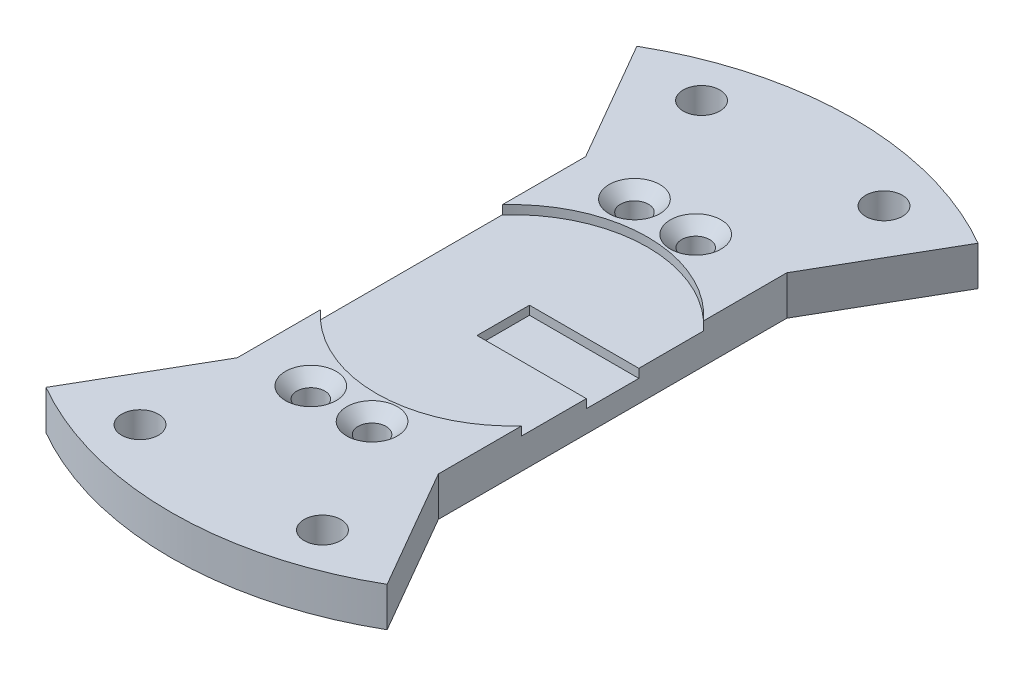
ISO-10303-21;
HEADER;
FILE_DESCRIPTION(('STEP AP214'),'2;1');
FILE_NAME('part.step','',(''),(''),'','','');
FILE_SCHEMA(('AUTOMOTIVE_DESIGN { 1 0 10303 214 1 1 1 1 }'));
ENDSEC;
DATA;
#1=APPLICATION_CONTEXT('core data for automotive mechanical design processes');
#2=APPLICATION_PROTOCOL_DEFINITION('international standard','automotive_design',2000,#1);
#3=PRODUCT_CONTEXT('',#1,'mechanical');
#4=PRODUCT('Part','Part','',(#3));
#5=PRODUCT_RELATED_PRODUCT_CATEGORY('part','',(#4));
#6=PRODUCT_DEFINITION_FORMATION('','',#4);
#7=PRODUCT_DEFINITION_CONTEXT('part definition',#1,'design');
#8=PRODUCT_DEFINITION('design','',#6,#7);
#9=PRODUCT_DEFINITION_SHAPE('','',#8);
#10=(LENGTH_UNIT() NAMED_UNIT(*) SI_UNIT(.MILLI.,.METRE.));
#11=(NAMED_UNIT(*) PLANE_ANGLE_UNIT() SI_UNIT($,.RADIAN.));
#12=(NAMED_UNIT(*) SI_UNIT($,.STERADIAN.) SOLID_ANGLE_UNIT());
#13=UNCERTAINTY_MEASURE_WITH_UNIT(LENGTH_MEASURE(1.E-05),#10,'distance_accuracy_value','');
#14=(GEOMETRIC_REPRESENTATION_CONTEXT(3) GLOBAL_UNCERTAINTY_ASSIGNED_CONTEXT((#13)) GLOBAL_UNIT_ASSIGNED_CONTEXT((#10,
#11,#12)) REPRESENTATION_CONTEXT('',''));
#15=CARTESIAN_POINT('',(0.,0.,0.));
#16=DIRECTION('',(0.,0.,1.));
#17=DIRECTION('',(1.,0.,0.));
#18=AXIS2_PLACEMENT_3D('',#15,#16,#17);
#19=CARTESIAN_POINT('',(0.,4.5,0.));
#20=DIRECTION('',(0.,1.,0.));
#21=DIRECTION('',(0.,0.,1.));
#22=AXIS2_PLACEMENT_3D('',#19,#20,#21);
#23=PLANE('',#22);
#24=CARTESIAN_POINT('',(-4.5,4.5,-18.5));
#25=DIRECTION('',(0.,1.,0.));
#26=DIRECTION('',(0.,0.,1.));
#27=AXIS2_PLACEMENT_3D('',#24,#25,#26);
#28=CIRCLE('',#27,2.9);
#29=CARTESIAN_POINT('',(-4.5,4.5,-15.6));
#30=VERTEX_POINT('',#29);
#31=EDGE_CURVE('E370',#30,#30,#28,.T.);
#32=ORIENTED_EDGE('',*,*,#31,.F.);
#33=EDGE_LOOP('',(#32));
#34=FACE_BOUND('',#33,.T.);
#35=CARTESIAN_POINT('',(2.5,4.5,-18.5));
#36=DIRECTION('',(0.,1.,0.));
#37=DIRECTION('',(0.,0.,1.));
#38=AXIS2_PLACEMENT_3D('',#35,#36,#37);
#39=CIRCLE('',#38,2.9);
#40=CARTESIAN_POINT('',(2.5,4.5,-15.6));
#41=VERTEX_POINT('',#40);
#42=EDGE_CURVE('E381',#41,#41,#39,.T.);
#43=ORIENTED_EDGE('',*,*,#42,.F.);
#44=EDGE_LOOP('',(#43));
#45=FACE_BOUND('',#44,.T.);
#46=CARTESIAN_POINT('',(0.,4.5,0.));
#47=DIRECTION('',(0.,1.,0.));
#48=DIRECTION('',(0.,0.,1.));
#49=AXIS2_PLACEMENT_3D('',#46,#47,#48);
#50=CIRCLE('',#49,15.5);
#51=CARTESIAN_POINT('',(11.5,4.5,-10.3923048454133));
#52=VERTEX_POINT('',#51);
#53=CARTESIAN_POINT('',(-11.5,4.5,-10.3923048454133));
#54=VERTEX_POINT('',#53);
#55=EDGE_CURVE('E276',#52,#54,#50,.T.);
#56=ORIENTED_EDGE('',*,*,#55,.F.);
#57=DIRECTION('',(0.,0.,1.));
#58=VECTOR('',#57,1.);
#59=CARTESIAN_POINT('',(11.5,4.5,0.));
#60=LINE('',#59,#58);
#61=CARTESIAN_POINT('',(11.5,4.5,-19.9185842870421));
#62=VERTEX_POINT('',#61);
#63=EDGE_CURVE('E207',#62,#52,#60,.T.);
#64=ORIENTED_EDGE('',*,*,#63,.F.);
#65=DIRECTION('',(0.5,0.,-0.866025403784439));
#66=VECTOR('',#65,1.);
#67=CARTESIAN_POINT('',(0.,4.5,0.));
#68=LINE('',#67,#66);
#69=CARTESIAN_POINT('',(19.5,4.5,-33.7749907475931));
#70=VERTEX_POINT('',#69);
#71=EDGE_CURVE('E210',#62,#70,#68,.T.);
#72=ORIENTED_EDGE('',*,*,#71,.T.);
#73=CARTESIAN_POINT('',(0.,4.5,0.));
#74=DIRECTION('',(0.,1.,0.));
#75=DIRECTION('',(0.,0.,1.));
#76=AXIS2_PLACEMENT_3D('',#73,#74,#75);
#77=CIRCLE('',#76,39.);
#78=CARTESIAN_POINT('',(-19.5,4.5,-33.7749907475931));
#79=VERTEX_POINT('',#78);
#80=EDGE_CURVE('E212',#70,#79,#77,.T.);
#81=ORIENTED_EDGE('',*,*,#80,.T.);
#82=DIRECTION('',(-0.5,0.,-0.866025403784439));
#83=VECTOR('',#82,1.);
#84=CARTESIAN_POINT('',(0.,4.5,0.));
#85=LINE('',#84,#83);
#86=CARTESIAN_POINT('',(-11.5,4.5,-19.9185842870421));
#87=VERTEX_POINT('',#86);
#88=EDGE_CURVE('E191',#87,#79,#85,.T.);
#89=ORIENTED_EDGE('',*,*,#88,.F.);
#90=DIRECTION('',(0.,0.,1.));
#91=VECTOR('',#90,1.);
#92=CARTESIAN_POINT('',(-11.5,4.5,0.));
#93=LINE('',#92,#91);
#94=EDGE_CURVE('E196',#87,#54,#93,.T.);
#95=ORIENTED_EDGE('',*,*,#94,.T.);
#96=EDGE_LOOP('',(#56,#64,#72,#81,#89,#95));
#97=FACE_BOUND('',#96,.T.);
#98=CARTESIAN_POINT('',(-10.4293235601544,4.5,-32.0981574249615));
#99=DIRECTION('',(0.,1.,0.));
#100=DIRECTION('',(0.,0.,1.));
#101=AXIS2_PLACEMENT_3D('',#98,#99,#100);
#102=CIRCLE('',#101,2.1);
#103=CARTESIAN_POINT('',(-10.4293235601544,4.5,-29.9981574249615));
#104=VERTEX_POINT('',#103);
#105=EDGE_CURVE('E223',#104,#104,#102,.T.);
#106=ORIENTED_EDGE('',*,*,#105,.F.);
#107=EDGE_LOOP('',(#106));
#108=FACE_BOUND('',#107,.T.);
#109=CARTESIAN_POINT('',(10.4293235601546,4.5,-32.0981574249614));
#110=DIRECTION('',(0.,1.,0.));
#111=DIRECTION('',(0.,0.,1.));
#112=AXIS2_PLACEMENT_3D('',#109,#110,#111);
#113=CIRCLE('',#112,2.1);
#114=CARTESIAN_POINT('',(10.4293235601546,4.5,-29.9981574249614));
#115=VERTEX_POINT('',#114);
#116=EDGE_CURVE('E220',#115,#115,#113,.T.);
#117=ORIENTED_EDGE('',*,*,#116,.F.);
#118=EDGE_LOOP('',(#117));
#119=FACE_BOUND('',#118,.T.);
#120=ADVANCED_FACE('F34',(#34,#45,#97,#108,#119),#23,.T.);
#121=CARTESIAN_POINT('',(0.,4.5,0.));
#122=DIRECTION('',(-0.866025403784439,0.,0.5));
#123=DIRECTION('',(0.5,0.,0.866025403784439));
#124=AXIS2_PLACEMENT_3D('',#121,#122,#123);
#125=PLANE('',#124);
#126=DIRECTION('',(-0.5,0.,-0.866025403784439));
#127=VECTOR('',#126,1.);
#128=CARTESIAN_POINT('',(0.,0.,0.));
#129=LINE('',#128,#127);
#130=CARTESIAN_POINT('',(-11.5,0.,-19.9185842870421));
#131=VERTEX_POINT('',#130);
#132=CARTESIAN_POINT('',(-19.5,0.,-33.7749907475931));
#133=VERTEX_POINT('',#132);
#134=EDGE_CURVE('E190',#131,#133,#129,.T.);
#135=ORIENTED_EDGE('',*,*,#134,.F.);
#136=DIRECTION('',(0.,-1.,0.));
#137=VECTOR('',#136,1.);
#138=CARTESIAN_POINT('',(-11.5,4.5,-19.9185842870421));
#139=LINE('',#138,#137);
#140=EDGE_CURVE('E274',#87,#131,#139,.T.);
#141=ORIENTED_EDGE('',*,*,#140,.F.);
#142=ORIENTED_EDGE('',*,*,#88,.T.);
#143=DIRECTION('',(0.,-1.,0.));
#144=VECTOR('',#143,1.);
#145=CARTESIAN_POINT('',(-19.5,4.5,-33.7749907475931));
#146=LINE('',#145,#144);
#147=EDGE_CURVE('E226',#79,#133,#146,.T.);
#148=ORIENTED_EDGE('',*,*,#147,.T.);
#149=EDGE_LOOP('',(#135,#141,#142,#148));
#150=FACE_BOUND('',#149,.T.);
#151=ADVANCED_FACE('F36',(#150),#125,.T.);
#152=CARTESIAN_POINT('',(-11.5,4.5,0.));
#153=DIRECTION('',(1.,0.,0.));
#154=DIRECTION('',(0.,0.,-1.));
#155=AXIS2_PLACEMENT_3D('',#152,#153,#154);
#156=PLANE('',#155);
#157=DIRECTION('',(0.,0.,1.));
#158=VECTOR('',#157,1.);
#159=CARTESIAN_POINT('',(-11.5,3.5,0.));
#160=LINE('',#159,#158);
#161=CARTESIAN_POINT('',(-11.5,3.5,-10.3923048454133));
#162=VERTEX_POINT('',#161);
#163=CARTESIAN_POINT('',(-11.5,3.5,10.3923048454133));
#164=VERTEX_POINT('',#163);
#165=EDGE_CURVE('E188',#162,#164,#160,.T.);
#166=ORIENTED_EDGE('',*,*,#165,.F.);
#167=DIRECTION('',(0.,1.,0.));
#168=VECTOR('',#167,1.);
#169=CARTESIAN_POINT('',(-11.5,3.5,-10.3923048454133));
#170=LINE('',#169,#168);
#171=EDGE_CURVE('E185',#162,#54,#170,.T.);
#172=ORIENTED_EDGE('',*,*,#171,.T.);
#173=ORIENTED_EDGE('',*,*,#94,.F.);
#174=ORIENTED_EDGE('',*,*,#140,.T.);
#175=DIRECTION('',(0.,0.,1.));
#176=VECTOR('',#175,1.);
#177=CARTESIAN_POINT('',(-11.5,0.,0.));
#178=LINE('',#177,#176);
#179=CARTESIAN_POINT('',(-11.5,0.,19.9185842870424));
#180=VERTEX_POINT('',#179);
#181=EDGE_CURVE('E229',#131,#180,#178,.T.);
#182=ORIENTED_EDGE('',*,*,#181,.T.);
#183=DIRECTION('',(0.,-1.,0.));
#184=VECTOR('',#183,1.);
#185=CARTESIAN_POINT('',(-11.5,4.5,19.9185842870424));
#186=LINE('',#185,#184);
#187=CARTESIAN_POINT('',(-11.5,4.5,19.9185842870424));
#188=VERTEX_POINT('',#187);
#189=EDGE_CURVE('E271',#188,#180,#186,.T.);
#190=ORIENTED_EDGE('',*,*,#189,.F.);
#191=CARTESIAN_POINT('',(-11.5,4.5,10.3923048454133));
#192=VERTEX_POINT('',#191);
#193=EDGE_CURVE('E194',#192,#188,#93,.T.);
#194=ORIENTED_EDGE('',*,*,#193,.F.);
#195=DIRECTION('',(0.,1.,0.));
#196=VECTOR('',#195,1.);
#197=CARTESIAN_POINT('',(-11.5,3.5,10.3923048454133));
#198=LINE('',#197,#196);
#199=EDGE_CURVE('E57',#192,#164,#198,.F.);
#200=ORIENTED_EDGE('',*,*,#199,.T.);
#201=EDGE_LOOP('',(#166,#172,#173,#174,#182,#190,#194,#200));
#202=FACE_BOUND('',#201,.T.);
#203=ADVANCED_FACE('F290',(#202),#156,.F.);
#204=CARTESIAN_POINT('',(0.,4.5,0.));
#205=DIRECTION('',(0.866025403784442,0.,0.499999999999995));
#206=DIRECTION('',(0.499999999999995,0.,-0.866025403784442));
#207=AXIS2_PLACEMENT_3D('',#204,#205,#206);
#208=PLANE('',#207);
#209=DIRECTION('',(-0.499999999999995,0.,0.866025403784442));
#210=VECTOR('',#209,1.);
#211=CARTESIAN_POINT('',(0.,0.,0.));
#212=LINE('',#211,#210);
#213=CARTESIAN_POINT('',(-19.4999999999998,0.,33.7749907475932));
#214=VERTEX_POINT('',#213);
#215=EDGE_CURVE('E231',#180,#214,#212,.T.);
#216=ORIENTED_EDGE('',*,*,#215,.T.);
#217=DIRECTION('',(0.,-1.,0.));
#218=VECTOR('',#217,1.);
#219=CARTESIAN_POINT('',(-19.4999999999998,4.5,33.7749907475932));
#220=LINE('',#219,#218);
#221=CARTESIAN_POINT('',(-19.4999999999998,4.5,33.7749907475932));
#222=VERTEX_POINT('',#221);
#223=EDGE_CURVE('E268',#222,#214,#220,.T.);
#224=ORIENTED_EDGE('',*,*,#223,.F.);
#225=DIRECTION('',(-0.499999999999995,0.,0.866025403784442));
#226=VECTOR('',#225,1.);
#227=CARTESIAN_POINT('',(0.,4.5,0.));
#228=LINE('',#227,#226);
#229=EDGE_CURVE('E199',#188,#222,#228,.T.);
#230=ORIENTED_EDGE('',*,*,#229,.F.);
#231=ORIENTED_EDGE('',*,*,#189,.T.);
#232=EDGE_LOOP('',(#216,#224,#230,#231));
#233=FACE_BOUND('',#232,.T.);
#234=ADVANCED_FACE('F620',(#233),#208,.F.);
#235=CARTESIAN_POINT('',(0.,4.5,0.));
#236=DIRECTION('',(0.,-1.,0.));
#237=DIRECTION('',(0.,0.,-1.));
#238=AXIS2_PLACEMENT_3D('',#235,#236,#237);
#239=CYLINDRICAL_SURFACE('',#238,39.);
#240=CARTESIAN_POINT('',(0.,0.,0.));
#241=DIRECTION('',(0.,1.,0.));
#242=DIRECTION('',(0.,0.,1.));
#243=AXIS2_PLACEMENT_3D('',#240,#241,#242);
#244=CIRCLE('',#243,39.);
#245=CARTESIAN_POINT('',(19.4999999999998,0.,33.7749907475932));
#246=VERTEX_POINT('',#245);
#247=EDGE_CURVE('E233',#214,#246,#244,.T.);
#248=ORIENTED_EDGE('',*,*,#247,.T.);
#249=DIRECTION('',(0.,-1.,0.));
#250=VECTOR('',#249,1.);
#251=CARTESIAN_POINT('',(19.4999999999998,4.5,33.7749907475932));
#252=LINE('',#251,#250);
#253=CARTESIAN_POINT('',(19.4999999999998,4.5,33.7749907475932));
#254=VERTEX_POINT('',#253);
#255=EDGE_CURVE('E266',#254,#246,#252,.T.);
#256=ORIENTED_EDGE('',*,*,#255,.F.);
#257=CARTESIAN_POINT('',(0.,4.5,0.));
#258=DIRECTION('',(0.,1.,0.));
#259=DIRECTION('',(0.,0.,1.));
#260=AXIS2_PLACEMENT_3D('',#257,#258,#259);
#261=CIRCLE('',#260,39.);
#262=EDGE_CURVE('E201',#222,#254,#261,.T.);
#263=ORIENTED_EDGE('',*,*,#262,.F.);
#264=ORIENTED_EDGE('',*,*,#223,.T.);
#265=EDGE_LOOP('',(#248,#256,#263,#264));
#266=FACE_BOUND('',#265,.T.);
#267=ADVANCED_FACE('F611',(#266),#239,.T.);
#268=CARTESIAN_POINT('',(0.,4.5,0.));
#269=DIRECTION('',(0.866025403784442,0.,-0.499999999999995));
#270=DIRECTION('',(-0.499999999999995,0.,-0.866025403784442));
#271=AXIS2_PLACEMENT_3D('',#268,#269,#270);
#272=PLANE('',#271);
#273=DIRECTION('',(0.499999999999995,0.,0.866025403784442));
#274=VECTOR('',#273,1.);
#275=CARTESIAN_POINT('',(0.,0.,0.));
#276=LINE('',#275,#274);
#277=CARTESIAN_POINT('',(11.5,0.,19.9185842870424));
#278=VERTEX_POINT('',#277);
#279=EDGE_CURVE('E236',#278,#246,#276,.T.);
#280=ORIENTED_EDGE('',*,*,#279,.F.);
#281=DIRECTION('',(0.,-1.,0.));
#282=VECTOR('',#281,1.);
#283=CARTESIAN_POINT('',(11.5,4.5,19.9185842870424));
#284=LINE('',#283,#282);
#285=CARTESIAN_POINT('',(11.5,4.5,19.9185842870424));
#286=VERTEX_POINT('',#285);
#287=EDGE_CURVE('E264',#286,#278,#284,.T.);
#288=ORIENTED_EDGE('',*,*,#287,.F.);
#289=DIRECTION('',(0.499999999999995,0.,0.866025403784442));
#290=VECTOR('',#289,1.);
#291=CARTESIAN_POINT('',(0.,4.5,0.));
#292=LINE('',#291,#290);
#293=EDGE_CURVE('E203',#286,#254,#292,.T.);
#294=ORIENTED_EDGE('',*,*,#293,.T.);
#295=ORIENTED_EDGE('',*,*,#255,.T.);
#296=EDGE_LOOP('',(#280,#288,#294,#295));
#297=FACE_BOUND('',#296,.T.);
#298=ADVANCED_FACE('F304',(#297),#272,.T.);
#299=CARTESIAN_POINT('',(11.5,4.5,0.));
#300=DIRECTION('',(1.,0.,0.));
#301=DIRECTION('',(0.,0.,-1.));
#302=AXIS2_PLACEMENT_3D('',#299,#300,#301);
#303=PLANE('',#302);
#304=DIRECTION('',(0.,1.,0.));
#305=VECTOR('',#304,1.);
#306=CARTESIAN_POINT('',(11.5,2.5,3.));
#307=LINE('',#306,#305);
#308=CARTESIAN_POINT('',(11.5,2.5,3.));
#309=VERTEX_POINT('',#308);
#310=CARTESIAN_POINT('',(11.5,3.5,3.));
#311=VERTEX_POINT('',#310);
#312=EDGE_CURVE('E178',#309,#311,#307,.T.);
#313=ORIENTED_EDGE('',*,*,#312,.T.);
#314=DIRECTION('',(0.,0.,1.));
#315=VECTOR('',#314,1.);
#316=CARTESIAN_POINT('',(11.5,3.5,0.));
#317=LINE('',#316,#315);
#318=CARTESIAN_POINT('',(11.5,3.5,10.3923048454133));
#319=VERTEX_POINT('',#318);
#320=EDGE_CURVE('E42',#311,#319,#317,.T.);
#321=ORIENTED_EDGE('',*,*,#320,.T.);
#322=DIRECTION('',(0.,1.,0.));
#323=VECTOR('',#322,1.);
#324=CARTESIAN_POINT('',(11.5,3.5,10.3923048454133));
#325=LINE('',#324,#323);
#326=CARTESIAN_POINT('',(11.5,4.5,10.3923048454133));
#327=VERTEX_POINT('',#326);
#328=EDGE_CURVE('E179',#327,#319,#325,.F.);
#329=ORIENTED_EDGE('',*,*,#328,.F.);
#330=EDGE_CURVE('E206',#327,#286,#60,.T.);
#331=ORIENTED_EDGE('',*,*,#330,.T.);
#332=ORIENTED_EDGE('',*,*,#287,.T.);
#333=DIRECTION('',(0.,0.,1.));
#334=VECTOR('',#333,1.);
#335=CARTESIAN_POINT('',(11.5,0.,0.));
#336=LINE('',#335,#334);
#337=CARTESIAN_POINT('',(11.5,0.,-19.9185842870421));
#338=VERTEX_POINT('',#337);
#339=EDGE_CURVE('E239',#338,#278,#336,.T.);
#340=ORIENTED_EDGE('',*,*,#339,.F.);
#341=DIRECTION('',(0.,-1.,0.));
#342=VECTOR('',#341,1.);
#343=CARTESIAN_POINT('',(11.5,4.5,-19.9185842870421));
#344=LINE('',#343,#342);
#345=EDGE_CURVE('E262',#62,#338,#344,.T.);
#346=ORIENTED_EDGE('',*,*,#345,.F.);
#347=ORIENTED_EDGE('',*,*,#63,.T.);
#348=DIRECTION('',(0.,1.,0.));
#349=VECTOR('',#348,1.);
#350=CARTESIAN_POINT('',(11.5,3.5,-10.3923048454133));
#351=LINE('',#350,#349);
#352=CARTESIAN_POINT('',(11.5,3.5,-10.3923048454133));
#353=VERTEX_POINT('',#352);
#354=EDGE_CURVE('E182',#353,#52,#351,.T.);
#355=ORIENTED_EDGE('',*,*,#354,.F.);
#356=CARTESIAN_POINT('',(11.5,3.5,-3.));
#357=VERTEX_POINT('',#356);
#358=EDGE_CURVE('E11',#353,#357,#317,.T.);
#359=ORIENTED_EDGE('',*,*,#358,.T.);
#360=DIRECTION('',(0.,1.,0.));
#361=VECTOR('',#360,1.);
#362=CARTESIAN_POINT('',(11.5,2.5,-3.));
#363=LINE('',#362,#361);
#364=CARTESIAN_POINT('',(11.5,2.5,-3.));
#365=VERTEX_POINT('',#364);
#366=EDGE_CURVE('E49',#365,#357,#363,.T.);
#367=ORIENTED_EDGE('',*,*,#366,.F.);
#368=DIRECTION('',(0.,0.,-1.));
#369=VECTOR('',#368,1.);
#370=CARTESIAN_POINT('',(11.5,2.5,-3.));
#371=LINE('',#370,#369);
#372=EDGE_CURVE('E155',#309,#365,#371,.T.);
#373=ORIENTED_EDGE('',*,*,#372,.F.);
#374=EDGE_LOOP('',(#313,#321,#329,#331,#332,#340,#346,#347,#355,#359,#367,#373));
#375=FACE_BOUND('',#374,.T.);
#376=ADVANCED_FACE('F166',(#375),#303,.T.);
#377=CARTESIAN_POINT('',(0.,4.5,0.));
#378=DIRECTION('',(-0.866025403784439,0.,-0.5));
#379=DIRECTION('',(-0.5,0.,0.866025403784439));
#380=AXIS2_PLACEMENT_3D('',#377,#378,#379);
#381=PLANE('',#380);
#382=DIRECTION('',(0.5,0.,-0.866025403784439));
#383=VECTOR('',#382,1.);
#384=CARTESIAN_POINT('',(0.,0.,0.));
#385=LINE('',#384,#383);
#386=CARTESIAN_POINT('',(19.5,0.,-33.7749907475931));
#387=VERTEX_POINT('',#386);
#388=EDGE_CURVE('E242',#338,#387,#385,.T.);
#389=ORIENTED_EDGE('',*,*,#388,.T.);
#390=DIRECTION('',(0.,-1.,0.));
#391=VECTOR('',#390,1.);
#392=CARTESIAN_POINT('',(19.5,4.5,-33.7749907475931));
#393=LINE('',#392,#391);
#394=EDGE_CURVE('E259',#70,#387,#393,.T.);
#395=ORIENTED_EDGE('',*,*,#394,.F.);
#396=ORIENTED_EDGE('',*,*,#71,.F.);
#397=ORIENTED_EDGE('',*,*,#345,.T.);
#398=EDGE_LOOP('',(#389,#395,#396,#397));
#399=FACE_BOUND('',#398,.T.);
#400=ADVANCED_FACE('F316',(#399),#381,.F.);
#401=CARTESIAN_POINT('',(10.4293235601546,4.5,-32.0981574249614));
#402=DIRECTION('',(0.,-1.,0.));
#403=DIRECTION('',(0.,0.,-1.));
#404=AXIS2_PLACEMENT_3D('',#401,#402,#403);
#405=CYLINDRICAL_SURFACE('',#404,2.1);
#406=ORIENTED_EDGE('',*,*,#116,.T.);
#407=EDGE_LOOP('',(#406));
#408=FACE_BOUND('',#407,.T.);
#409=CARTESIAN_POINT('',(10.4293235601546,0.,-32.0981574249614));
#410=DIRECTION('',(0.,1.,0.));
#411=DIRECTION('',(0.,0.,1.));
#412=AXIS2_PLACEMENT_3D('',#409,#410,#411);
#413=CIRCLE('',#412,2.1);
#414=CARTESIAN_POINT('',(10.4293235601546,0.,-29.9981574249614));
#415=VERTEX_POINT('',#414);
#416=EDGE_CURVE('E253',#415,#415,#413,.T.);
#417=ORIENTED_EDGE('',*,*,#416,.F.);
#418=EDGE_LOOP('',(#417));
#419=FACE_BOUND('',#418,.T.);
#420=ADVANCED_FACE('F592',(#408,#419),#405,.F.);
#421=CARTESIAN_POINT('',(10.4293235601542,4.5,32.0981574249615));
#422=DIRECTION('',(0.,-1.,0.));
#423=DIRECTION('',(0.,0.,-1.));
#424=AXIS2_PLACEMENT_3D('',#421,#422,#423);
#425=CYLINDRICAL_SURFACE('',#424,2.1);
#426=CARTESIAN_POINT('',(10.4293235601542,4.5,32.0981574249615));
#427=DIRECTION('',(0.,1.,0.));
#428=DIRECTION('',(0.,0.,1.));
#429=AXIS2_PLACEMENT_3D('',#426,#427,#428);
#430=CIRCLE('',#429,2.1);
#431=CARTESIAN_POINT('',(10.4293235601542,4.5,34.1981574249615));
#432=VERTEX_POINT('',#431);
#433=EDGE_CURVE('E217',#432,#432,#430,.T.);
#434=ORIENTED_EDGE('',*,*,#433,.T.);
#435=EDGE_LOOP('',(#434));
#436=FACE_BOUND('',#435,.T.);
#437=CARTESIAN_POINT('',(10.4293235601542,0.,32.0981574249615));
#438=DIRECTION('',(0.,1.,0.));
#439=DIRECTION('',(0.,0.,1.));
#440=AXIS2_PLACEMENT_3D('',#437,#438,#439);
#441=CIRCLE('',#440,2.1);
#442=CARTESIAN_POINT('',(10.4293235601542,0.,34.1981574249615));
#443=VERTEX_POINT('',#442);
#444=EDGE_CURVE('E250',#443,#443,#441,.T.);
#445=ORIENTED_EDGE('',*,*,#444,.F.);
#446=EDGE_LOOP('',(#445));
#447=FACE_BOUND('',#446,.T.);
#448=ADVANCED_FACE('F338',(#436,#447),#425,.F.);
#449=CARTESIAN_POINT('',(-10.4293235601548,4.5,32.0981574249613));
#450=DIRECTION('',(0.,-1.,0.));
#451=DIRECTION('',(0.,0.,-1.));
#452=AXIS2_PLACEMENT_3D('',#449,#450,#451);
#453=CYLINDRICAL_SURFACE('',#452,2.1);
#454=CARTESIAN_POINT('',(-10.4293235601548,4.5,32.0981574249613));
#455=DIRECTION('',(0.,1.,0.));
#456=DIRECTION('',(0.,0.,1.));
#457=AXIS2_PLACEMENT_3D('',#454,#455,#456);
#458=CIRCLE('',#457,2.1);
#459=CARTESIAN_POINT('',(-10.4293235601548,4.5,34.1981574249613));
#460=VERTEX_POINT('',#459);
#461=EDGE_CURVE('E214',#460,#460,#458,.T.);
#462=ORIENTED_EDGE('',*,*,#461,.T.);
#463=EDGE_LOOP('',(#462));
#464=FACE_BOUND('',#463,.T.);
#465=CARTESIAN_POINT('',(-10.4293235601548,0.,32.0981574249613));
#466=DIRECTION('',(0.,1.,0.));
#467=DIRECTION('',(0.,0.,1.));
#468=AXIS2_PLACEMENT_3D('',#465,#466,#467);
#469=CIRCLE('',#468,2.1);
#470=CARTESIAN_POINT('',(-10.4293235601548,0.,34.1981574249613));
#471=VERTEX_POINT('',#470);
#472=EDGE_CURVE('E247',#471,#471,#469,.T.);
#473=ORIENTED_EDGE('',*,*,#472,.F.);
#474=EDGE_LOOP('',(#473));
#475=FACE_BOUND('',#474,.T.);
#476=ADVANCED_FACE('F330',(#464,#475),#453,.F.);
#477=CARTESIAN_POINT('',(0.,4.5,0.));
#478=DIRECTION('',(0.,-1.,0.));
#479=DIRECTION('',(0.,0.,-1.));
#480=AXIS2_PLACEMENT_3D('',#477,#478,#479);
#481=CYLINDRICAL_SURFACE('',#480,39.);
#482=CARTESIAN_POINT('',(0.,0.,0.));
#483=DIRECTION('',(0.,1.,0.));
#484=DIRECTION('',(0.,0.,1.));
#485=AXIS2_PLACEMENT_3D('',#482,#483,#484);
#486=CIRCLE('',#485,39.);
#487=EDGE_CURVE('E244',#387,#133,#486,.T.);
#488=ORIENTED_EDGE('',*,*,#487,.T.);
#489=ORIENTED_EDGE('',*,*,#147,.F.);
#490=ORIENTED_EDGE('',*,*,#80,.F.);
#491=ORIENTED_EDGE('',*,*,#394,.T.);
#492=EDGE_LOOP('',(#488,#489,#490,#491));
#493=FACE_BOUND('',#492,.T.);
#494=ADVANCED_FACE('F327',(#493),#481,.T.);
#495=CARTESIAN_POINT('',(-10.4293235601544,4.5,-32.0981574249615));
#496=DIRECTION('',(0.,-1.,0.));
#497=DIRECTION('',(0.,0.,-1.));
#498=AXIS2_PLACEMENT_3D('',#495,#496,#497);
#499=CYLINDRICAL_SURFACE('',#498,2.1);
#500=ORIENTED_EDGE('',*,*,#105,.T.);
#501=EDGE_LOOP('',(#500));
#502=FACE_BOUND('',#501,.T.);
#503=CARTESIAN_POINT('',(-10.4293235601544,0.,-32.0981574249615));
#504=DIRECTION('',(0.,1.,0.));
#505=DIRECTION('',(0.,0.,1.));
#506=AXIS2_PLACEMENT_3D('',#503,#504,#505);
#507=CIRCLE('',#506,2.1);
#508=CARTESIAN_POINT('',(-10.4293235601544,0.,-29.9981574249615));
#509=VERTEX_POINT('',#508);
#510=EDGE_CURVE('E195',#509,#509,#507,.T.);
#511=ORIENTED_EDGE('',*,*,#510,.F.);
#512=EDGE_LOOP('',(#511));
#513=FACE_BOUND('',#512,.T.);
#514=ADVANCED_FACE('F329',(#502,#513),#499,.F.);
#515=CARTESIAN_POINT('',(-4.5,4.5,18.5));
#516=DIRECTION('',(0.,1.,0.));
#517=DIRECTION('',(0.,0.,1.));
#518=AXIS2_PLACEMENT_3D('',#515,#516,#517);
#519=CIRCLE('',#518,2.9);
#520=CARTESIAN_POINT('',(-4.5,4.5,21.4));
#521=VERTEX_POINT('',#520);
#522=EDGE_CURVE('E361',#521,#521,#519,.T.);
#523=ORIENTED_EDGE('',*,*,#522,.F.);
#524=EDGE_LOOP('',(#523));
#525=FACE_BOUND('',#524,.T.);
#526=CARTESIAN_POINT('',(2.5,4.5,18.5));
#527=DIRECTION('',(0.,1.,0.));
#528=DIRECTION('',(0.,0.,1.));
#529=AXIS2_PLACEMENT_3D('',#526,#527,#528);
#530=CIRCLE('',#529,2.9);
#531=CARTESIAN_POINT('',(2.5,4.5,21.4));
#532=VERTEX_POINT('',#531);
#533=EDGE_CURVE('E364',#532,#532,#530,.T.);
#534=ORIENTED_EDGE('',*,*,#533,.F.);
#535=EDGE_LOOP('',(#534));
#536=FACE_BOUND('',#535,.T.);
#537=EDGE_CURVE('E275',#192,#327,#50,.T.);
#538=ORIENTED_EDGE('',*,*,#537,.F.);
#539=ORIENTED_EDGE('',*,*,#193,.T.);
#540=ORIENTED_EDGE('',*,*,#229,.T.);
#541=ORIENTED_EDGE('',*,*,#262,.T.);
#542=ORIENTED_EDGE('',*,*,#293,.F.);
#543=ORIENTED_EDGE('',*,*,#330,.F.);
#544=EDGE_LOOP('',(#538,#539,#540,#541,#542,#543));
#545=FACE_BOUND('',#544,.T.);
#546=ORIENTED_EDGE('',*,*,#461,.F.);
#547=EDGE_LOOP('',(#546));
#548=FACE_BOUND('',#547,.T.);
#549=ORIENTED_EDGE('',*,*,#433,.F.);
#550=EDGE_LOOP('',(#549));
#551=FACE_BOUND('',#550,.T.);
#552=ADVANCED_FACE('F296',(#525,#536,#545,#548,#551),#23,.T.);
#553=CARTESIAN_POINT('',(0.,0.,0.));
#554=DIRECTION('',(0.,1.,0.));
#555=DIRECTION('',(0.,0.,1.));
#556=AXIS2_PLACEMENT_3D('',#553,#554,#555);
#557=PLANE('',#556);
#558=CARTESIAN_POINT('',(2.5,0.,18.5));
#559=DIRECTION('',(0.,1.,0.));
#560=DIRECTION('',(0.,0.,1.));
#561=AXIS2_PLACEMENT_3D('',#558,#559,#560);
#562=CIRCLE('',#561,1.6);
#563=CARTESIAN_POINT('',(2.5,0.,20.1));
#564=VERTEX_POINT('',#563);
#565=EDGE_CURVE('E391',#564,#564,#562,.T.);
#566=ORIENTED_EDGE('',*,*,#565,.T.);
#567=EDGE_LOOP('',(#566));
#568=FACE_BOUND('',#567,.T.);
#569=CARTESIAN_POINT('',(-4.5,0.,-18.5));
#570=DIRECTION('',(0.,1.,0.));
#571=DIRECTION('',(0.,0.,1.));
#572=AXIS2_PLACEMENT_3D('',#569,#570,#571);
#573=CIRCLE('',#572,1.6);
#574=CARTESIAN_POINT('',(-4.5,0.,-16.9));
#575=VERTEX_POINT('',#574);
#576=EDGE_CURVE('E390',#575,#575,#573,.T.);
#577=ORIENTED_EDGE('',*,*,#576,.T.);
#578=EDGE_LOOP('',(#577));
#579=FACE_BOUND('',#578,.T.);
#580=CARTESIAN_POINT('',(2.5,0.,-18.5));
#581=DIRECTION('',(0.,1.,0.));
#582=DIRECTION('',(0.,0.,1.));
#583=AXIS2_PLACEMENT_3D('',#580,#581,#582);
#584=CIRCLE('',#583,1.6);
#585=CARTESIAN_POINT('',(2.5,0.,-16.9));
#586=VERTEX_POINT('',#585);
#587=EDGE_CURVE('E387',#586,#586,#584,.T.);
#588=ORIENTED_EDGE('',*,*,#587,.T.);
#589=EDGE_LOOP('',(#588));
#590=FACE_BOUND('',#589,.T.);
#591=CARTESIAN_POINT('',(-4.5,0.,18.5));
#592=DIRECTION('',(0.,1.,0.));
#593=DIRECTION('',(0.,0.,1.));
#594=AXIS2_PLACEMENT_3D('',#591,#592,#593);
#595=CIRCLE('',#594,1.6);
#596=CARTESIAN_POINT('',(-4.5,0.,20.1));
#597=VERTEX_POINT('',#596);
#598=EDGE_CURVE('E394',#597,#597,#595,.T.);
#599=ORIENTED_EDGE('',*,*,#598,.T.);
#600=EDGE_LOOP('',(#599));
#601=FACE_BOUND('',#600,.T.);
#602=ORIENTED_EDGE('',*,*,#134,.T.);
#603=ORIENTED_EDGE('',*,*,#487,.F.);
#604=ORIENTED_EDGE('',*,*,#388,.F.);
#605=ORIENTED_EDGE('',*,*,#339,.T.);
#606=ORIENTED_EDGE('',*,*,#279,.T.);
#607=ORIENTED_EDGE('',*,*,#247,.F.);
#608=ORIENTED_EDGE('',*,*,#215,.F.);
#609=ORIENTED_EDGE('',*,*,#181,.F.);
#610=EDGE_LOOP('',(#602,#603,#604,#605,#606,#607,#608,#609));
#611=FACE_BOUND('',#610,.T.);
#612=ORIENTED_EDGE('',*,*,#472,.T.);
#613=EDGE_LOOP('',(#612));
#614=FACE_BOUND('',#613,.T.);
#615=ORIENTED_EDGE('',*,*,#444,.T.);
#616=EDGE_LOOP('',(#615));
#617=FACE_BOUND('',#616,.T.);
#618=ORIENTED_EDGE('',*,*,#416,.T.);
#619=EDGE_LOOP('',(#618));
#620=FACE_BOUND('',#619,.T.);
#621=ORIENTED_EDGE('',*,*,#510,.T.);
#622=EDGE_LOOP('',(#621));
#623=FACE_BOUND('',#622,.T.);
#624=ADVANCED_FACE('F309',(#568,#579,#590,#601,#611,#614,#617,#620,#623),#557,.F.);
#625=CARTESIAN_POINT('',(0.,3.5,0.));
#626=DIRECTION('',(0.,1.,0.));
#627=DIRECTION('',(0.,0.,1.));
#628=AXIS2_PLACEMENT_3D('',#625,#626,#627);
#629=PLANE('',#628);
#630=DIRECTION('',(1.,0.,0.));
#631=VECTOR('',#630,1.);
#632=CARTESIAN_POINT('',(11.5,3.5,3.));
#633=LINE('',#632,#631);
#634=CARTESIAN_POINT('',(-0.999999999999999,3.5,3.));
#635=VERTEX_POINT('',#634);
#636=EDGE_CURVE('E164',#635,#311,#633,.T.);
#637=ORIENTED_EDGE('',*,*,#636,.F.);
#638=DIRECTION('',(0.,0.,1.));
#639=VECTOR('',#638,1.);
#640=CARTESIAN_POINT('',(-0.999999999999999,3.5,-3.));
#641=LINE('',#640,#639);
#642=CARTESIAN_POINT('',(-0.999999999999999,3.5,-3.));
#643=VERTEX_POINT('',#642);
#644=EDGE_CURVE('E402',#643,#635,#641,.T.);
#645=ORIENTED_EDGE('',*,*,#644,.F.);
#646=DIRECTION('',(-1.,0.,0.));
#647=VECTOR('',#646,1.);
#648=CARTESIAN_POINT('',(11.5,3.5,-3.));
#649=LINE('',#648,#647);
#650=EDGE_CURVE('E398',#357,#643,#649,.T.);
#651=ORIENTED_EDGE('',*,*,#650,.F.);
#652=ORIENTED_EDGE('',*,*,#358,.F.);
#653=CARTESIAN_POINT('',(0.,3.5,0.));
#654=DIRECTION('',(0.,1.,0.));
#655=DIRECTION('',(0.,0.,1.));
#656=AXIS2_PLACEMENT_3D('',#653,#654,#655);
#657=CIRCLE('',#656,15.5);
#658=EDGE_CURVE('E177',#353,#162,#657,.T.);
#659=ORIENTED_EDGE('',*,*,#658,.T.);
#660=ORIENTED_EDGE('',*,*,#165,.T.);
#661=EDGE_CURVE('E174',#164,#319,#657,.T.);
#662=ORIENTED_EDGE('',*,*,#661,.T.);
#663=ORIENTED_EDGE('',*,*,#320,.F.);
#664=EDGE_LOOP('',(#637,#645,#651,#652,#659,#660,#662,#663));
#665=FACE_BOUND('',#664,.T.);
#666=ADVANCED_FACE('F285',(#665),#629,.T.);
#667=CARTESIAN_POINT('',(0.,3.5,0.));
#668=DIRECTION('',(0.,1.,0.));
#669=DIRECTION('',(0.,0.,1.));
#670=AXIS2_PLACEMENT_3D('',#667,#668,#669);
#671=CYLINDRICAL_SURFACE('',#670,15.5);
#672=ORIENTED_EDGE('',*,*,#658,.F.);
#673=ORIENTED_EDGE('',*,*,#354,.T.);
#674=ORIENTED_EDGE('',*,*,#55,.T.);
#675=ORIENTED_EDGE('',*,*,#171,.F.);
#676=EDGE_LOOP('',(#672,#673,#674,#675));
#677=FACE_BOUND('',#676,.T.);
#678=ADVANCED_FACE('F411',(#677),#671,.F.);
#679=ORIENTED_EDGE('',*,*,#537,.T.);
#680=ORIENTED_EDGE('',*,*,#328,.T.);
#681=ORIENTED_EDGE('',*,*,#661,.F.);
#682=ORIENTED_EDGE('',*,*,#199,.F.);
#683=EDGE_LOOP('',(#679,#680,#681,#682));
#684=FACE_BOUND('',#683,.T.);
#685=ADVANCED_FACE('F284',(#684),#671,.F.);
#686=CARTESIAN_POINT('',(11.5,2.5,3.));
#687=DIRECTION('',(0.,0.,1.));
#688=DIRECTION('',(1.,0.,0.));
#689=AXIS2_PLACEMENT_3D('',#686,#687,#688);
#690=PLANE('',#689);
#691=ORIENTED_EDGE('',*,*,#636,.T.);
#692=ORIENTED_EDGE('',*,*,#312,.F.);
#693=DIRECTION('',(1.,0.,0.));
#694=VECTOR('',#693,1.);
#695=CARTESIAN_POINT('',(11.5,2.5,3.));
#696=LINE('',#695,#694);
#697=CARTESIAN_POINT('',(-0.999999999999999,2.5,3.));
#698=VERTEX_POINT('',#697);
#699=EDGE_CURVE('E161',#698,#309,#696,.T.);
#700=ORIENTED_EDGE('',*,*,#699,.F.);
#701=DIRECTION('',(0.,1.,0.));
#702=VECTOR('',#701,1.);
#703=CARTESIAN_POINT('',(-0.999999999999999,2.5,3.));
#704=LINE('',#703,#702);
#705=EDGE_CURVE('E169',#698,#635,#704,.T.);
#706=ORIENTED_EDGE('',*,*,#705,.T.);
#707=EDGE_LOOP('',(#691,#692,#700,#706));
#708=FACE_BOUND('',#707,.T.);
#709=ADVANCED_FACE('F407',(#708),#690,.F.);
#710=CARTESIAN_POINT('',(-0.999999999999999,2.5,-3.));
#711=DIRECTION('',(-1.,0.,0.));
#712=DIRECTION('',(0.,0.,1.));
#713=AXIS2_PLACEMENT_3D('',#710,#711,#712);
#714=PLANE('',#713);
#715=ORIENTED_EDGE('',*,*,#644,.T.);
#716=ORIENTED_EDGE('',*,*,#705,.F.);
#717=DIRECTION('',(0.,0.,1.));
#718=VECTOR('',#717,1.);
#719=CARTESIAN_POINT('',(-0.999999999999999,2.5,-3.));
#720=LINE('',#719,#718);
#721=CARTESIAN_POINT('',(-0.999999999999999,2.5,-3.));
#722=VERTEX_POINT('',#721);
#723=EDGE_CURVE('E154',#722,#698,#720,.T.);
#724=ORIENTED_EDGE('',*,*,#723,.F.);
#725=DIRECTION('',(0.,1.,0.));
#726=VECTOR('',#725,1.);
#727=CARTESIAN_POINT('',(-0.999999999999999,2.5,-3.));
#728=LINE('',#727,#726);
#729=EDGE_CURVE('E150',#722,#643,#728,.T.);
#730=ORIENTED_EDGE('',*,*,#729,.T.);
#731=EDGE_LOOP('',(#715,#716,#724,#730));
#732=FACE_BOUND('',#731,.T.);
#733=ADVANCED_FACE('F410',(#732),#714,.F.);
#734=CARTESIAN_POINT('',(11.5,2.5,-3.));
#735=DIRECTION('',(0.,0.,-1.));
#736=DIRECTION('',(-1.,0.,0.));
#737=AXIS2_PLACEMENT_3D('',#734,#735,#736);
#738=PLANE('',#737);
#739=ORIENTED_EDGE('',*,*,#650,.T.);
#740=ORIENTED_EDGE('',*,*,#729,.F.);
#741=DIRECTION('',(-1.,0.,0.));
#742=VECTOR('',#741,1.);
#743=CARTESIAN_POINT('',(11.5,2.5,-3.));
#744=LINE('',#743,#742);
#745=EDGE_CURVE('E147',#365,#722,#744,.T.);
#746=ORIENTED_EDGE('',*,*,#745,.F.);
#747=ORIENTED_EDGE('',*,*,#366,.T.);
#748=EDGE_LOOP('',(#739,#740,#746,#747));
#749=FACE_BOUND('',#748,.T.);
#750=ADVANCED_FACE('F149',(#749),#738,.F.);
#751=CARTESIAN_POINT('',(0.,2.5,0.));
#752=DIRECTION('',(0.,-1.,0.));
#753=DIRECTION('',(0.,0.,-1.));
#754=AXIS2_PLACEMENT_3D('',#751,#752,#753);
#755=PLANE('',#754);
#756=ORIENTED_EDGE('',*,*,#372,.T.);
#757=ORIENTED_EDGE('',*,*,#745,.T.);
#758=ORIENTED_EDGE('',*,*,#723,.T.);
#759=ORIENTED_EDGE('',*,*,#699,.T.);
#760=EDGE_LOOP('',(#756,#757,#758,#759));
#761=FACE_BOUND('',#760,.T.);
#762=ADVANCED_FACE('F159',(#761),#755,.F.);
#763=CARTESIAN_POINT('',(-4.5,0.,18.5));
#764=DIRECTION('',(0.,1.,0.));
#765=DIRECTION('',(0.,0.,1.));
#766=AXIS2_PLACEMENT_3D('',#763,#764,#765);
#767=CYLINDRICAL_SURFACE('',#766,1.6);
#768=CARTESIAN_POINT('',(-4.5,3.2,18.5));
#769=DIRECTION('',(0.,1.,0.));
#770=DIRECTION('',(0.,0.,1.));
#771=AXIS2_PLACEMENT_3D('',#768,#769,#770);
#772=CIRCLE('',#771,1.6);
#773=CARTESIAN_POINT('',(-4.5,3.2,20.1));
#774=VERTEX_POINT('',#773);
#775=EDGE_CURVE('E367',#774,#774,#772,.T.);
#776=ORIENTED_EDGE('',*,*,#775,.T.);
#777=EDGE_LOOP('',(#776));
#778=FACE_BOUND('',#777,.T.);
#779=ORIENTED_EDGE('',*,*,#598,.F.);
#780=EDGE_LOOP('',(#779));
#781=FACE_BOUND('',#780,.T.);
#782=ADVANCED_FACE('F427',(#778,#781),#767,.F.);
#783=CARTESIAN_POINT('',(2.5,0.,-18.5));
#784=DIRECTION('',(0.,1.,0.));
#785=DIRECTION('',(0.,0.,1.));
#786=AXIS2_PLACEMENT_3D('',#783,#784,#785);
#787=CYLINDRICAL_SURFACE('',#786,1.6);
#788=CARTESIAN_POINT('',(2.5,3.2,-18.5));
#789=DIRECTION('',(0.,1.,0.));
#790=DIRECTION('',(0.,0.,1.));
#791=AXIS2_PLACEMENT_3D('',#788,#789,#790);
#792=CIRCLE('',#791,1.6);
#793=CARTESIAN_POINT('',(2.5,3.2,-16.9));
#794=VERTEX_POINT('',#793);
#795=EDGE_CURVE('E384',#794,#794,#792,.T.);
#796=ORIENTED_EDGE('',*,*,#795,.T.);
#797=EDGE_LOOP('',(#796));
#798=FACE_BOUND('',#797,.T.);
#799=ORIENTED_EDGE('',*,*,#587,.F.);
#800=EDGE_LOOP('',(#799));
#801=FACE_BOUND('',#800,.T.);
#802=ADVANCED_FACE('F430',(#798,#801),#787,.F.);
#803=CARTESIAN_POINT('',(-4.5,0.,-18.5));
#804=DIRECTION('',(0.,1.,0.));
#805=DIRECTION('',(0.,0.,1.));
#806=AXIS2_PLACEMENT_3D('',#803,#804,#805);
#807=CYLINDRICAL_SURFACE('',#806,1.6);
#808=CARTESIAN_POINT('',(-4.5,3.2,-18.5));
#809=DIRECTION('',(0.,1.,0.));
#810=DIRECTION('',(0.,0.,1.));
#811=AXIS2_PLACEMENT_3D('',#808,#809,#810);
#812=CIRCLE('',#811,1.6);
#813=CARTESIAN_POINT('',(-4.5,3.2,-16.9));
#814=VERTEX_POINT('',#813);
#815=EDGE_CURVE('E378',#814,#814,#812,.T.);
#816=ORIENTED_EDGE('',*,*,#815,.T.);
#817=EDGE_LOOP('',(#816));
#818=FACE_BOUND('',#817,.T.);
#819=ORIENTED_EDGE('',*,*,#576,.F.);
#820=EDGE_LOOP('',(#819));
#821=FACE_BOUND('',#820,.T.);
#822=ADVANCED_FACE('F432',(#818,#821),#807,.F.);
#823=CARTESIAN_POINT('',(2.5,0.,18.5));
#824=DIRECTION('',(0.,1.,0.));
#825=DIRECTION('',(0.,0.,1.));
#826=AXIS2_PLACEMENT_3D('',#823,#824,#825);
#827=CYLINDRICAL_SURFACE('',#826,1.6);
#828=CARTESIAN_POINT('',(2.5,3.2,18.5));
#829=DIRECTION('',(0.,1.,0.));
#830=DIRECTION('',(0.,0.,1.));
#831=AXIS2_PLACEMENT_3D('',#828,#829,#830);
#832=CIRCLE('',#831,1.6);
#833=CARTESIAN_POINT('',(2.5,3.2,20.1));
#834=VERTEX_POINT('',#833);
#835=EDGE_CURVE('E366',#834,#834,#832,.T.);
#836=ORIENTED_EDGE('',*,*,#835,.T.);
#837=EDGE_LOOP('',(#836));
#838=FACE_BOUND('',#837,.T.);
#839=ORIENTED_EDGE('',*,*,#565,.F.);
#840=EDGE_LOOP('',(#839));
#841=FACE_BOUND('',#840,.T.);
#842=ADVANCED_FACE('F435',(#838,#841),#827,.F.);
#843=CARTESIAN_POINT('',(2.5,4.5,-18.5));
#844=DIRECTION('',(0.,1.,0.));
#845=DIRECTION('',(0.,0.,1.));
#846=AXIS2_PLACEMENT_3D('',#843,#844,#845);
#847=CONICAL_SURFACE('',#846,2.9,0.785398163397449);
#848=ORIENTED_EDGE('',*,*,#795,.F.);
#849=EDGE_LOOP('',(#848));
#850=FACE_BOUND('',#849,.T.);
#851=ORIENTED_EDGE('',*,*,#42,.T.);
#852=EDGE_LOOP('',(#851));
#853=FACE_BOUND('',#852,.T.);
#854=ADVANCED_FACE('F439',(#850,#853),#847,.F.);
#855=CARTESIAN_POINT('',(-4.5,4.5,-18.5));
#856=DIRECTION('',(0.,1.,0.));
#857=DIRECTION('',(0.,0.,1.));
#858=AXIS2_PLACEMENT_3D('',#855,#856,#857);
#859=CONICAL_SURFACE('',#858,2.9,0.785398163397449);
#860=ORIENTED_EDGE('',*,*,#815,.F.);
#861=EDGE_LOOP('',(#860));
#862=FACE_BOUND('',#861,.T.);
#863=ORIENTED_EDGE('',*,*,#31,.T.);
#864=EDGE_LOOP('',(#863));
#865=FACE_BOUND('',#864,.T.);
#866=ADVANCED_FACE('F446',(#862,#865),#859,.F.);
#867=CARTESIAN_POINT('',(2.5,4.5,18.5));
#868=DIRECTION('',(0.,1.,0.));
#869=DIRECTION('',(0.,0.,1.));
#870=AXIS2_PLACEMENT_3D('',#867,#868,#869);
#871=CONICAL_SURFACE('',#870,2.9,0.785398163397449);
#872=ORIENTED_EDGE('',*,*,#835,.F.);
#873=EDGE_LOOP('',(#872));
#874=FACE_BOUND('',#873,.T.);
#875=ORIENTED_EDGE('',*,*,#533,.T.);
#876=EDGE_LOOP('',(#875));
#877=FACE_BOUND('',#876,.T.);
#878=ADVANCED_FACE('F450',(#874,#877),#871,.F.);
#879=CARTESIAN_POINT('',(-4.5,4.5,18.5));
#880=DIRECTION('',(0.,1.,0.));
#881=DIRECTION('',(0.,0.,1.));
#882=AXIS2_PLACEMENT_3D('',#879,#880,#881);
#883=CONICAL_SURFACE('',#882,2.9,0.785398163397449);
#884=ORIENTED_EDGE('',*,*,#775,.F.);
#885=EDGE_LOOP('',(#884));
#886=FACE_BOUND('',#885,.T.);
#887=ORIENTED_EDGE('',*,*,#522,.T.);
#888=EDGE_LOOP('',(#887));
#889=FACE_BOUND('',#888,.T.);
#890=ADVANCED_FACE('F454',(#886,#889),#883,.F.);
#891=CLOSED_SHELL('',(#120,#151,#203,#234,#267,#298,#376,#400,#420,#448,#476,#494,#514,#552,
#624,#666,#678,#685,#709,#733,#750,#762,#782,#802,#822,#842,#854,#866,#878,#890));
#892=MANIFOLD_SOLID_BREP('B2',#891);
#893=ADVANCED_BREP_SHAPE_REPRESENTATION('',(#18,#892),#14);
#894=SHAPE_DEFINITION_REPRESENTATION(#9,#893);
ENDSEC;
END-ISO-10303-21;
